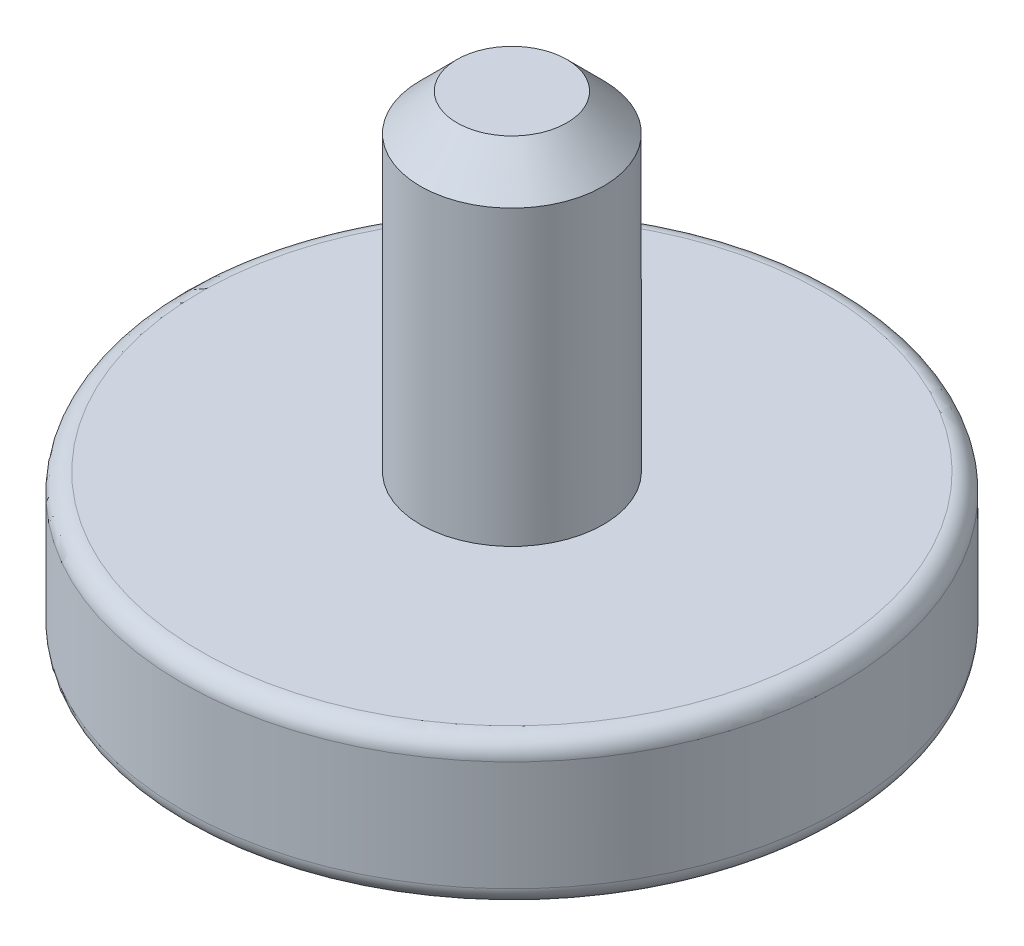
ISO-10303-21;
HEADER;
FILE_DESCRIPTION(('STEP AP214'),'2;1');
FILE_NAME('part.step','',(''),(''),'','','');
FILE_SCHEMA(('AUTOMOTIVE_DESIGN { 1 0 10303 214 1 1 1 1 }'));
ENDSEC;
DATA;
#1=APPLICATION_CONTEXT('core data for automotive mechanical design processes');
#2=APPLICATION_PROTOCOL_DEFINITION('international standard','automotive_design',2000,#1);
#3=PRODUCT_CONTEXT('',#1,'mechanical');
#4=PRODUCT('Part','Part','',(#3));
#5=PRODUCT_RELATED_PRODUCT_CATEGORY('part','',(#4));
#6=PRODUCT_DEFINITION_FORMATION('','',#4);
#7=PRODUCT_DEFINITION_CONTEXT('part definition',#1,'design');
#8=PRODUCT_DEFINITION('design','',#6,#7);
#9=PRODUCT_DEFINITION_SHAPE('','',#8);
#10=(LENGTH_UNIT() NAMED_UNIT(*) SI_UNIT(.MILLI.,.METRE.));
#11=(NAMED_UNIT(*) PLANE_ANGLE_UNIT() SI_UNIT($,.RADIAN.));
#12=(NAMED_UNIT(*) SI_UNIT($,.STERADIAN.) SOLID_ANGLE_UNIT());
#13=UNCERTAINTY_MEASURE_WITH_UNIT(LENGTH_MEASURE(1.E-05),#10,'distance_accuracy_value','');
#14=(GEOMETRIC_REPRESENTATION_CONTEXT(3) GLOBAL_UNCERTAINTY_ASSIGNED_CONTEXT((#13)) GLOBAL_UNIT_ASSIGNED_CONTEXT((#10,
#11,#12)) REPRESENTATION_CONTEXT('',''));
#15=CARTESIAN_POINT('',(0.,0.,0.));
#16=DIRECTION('',(0.,0.,1.));
#17=DIRECTION('',(1.,0.,0.));
#18=AXIS2_PLACEMENT_3D('',#15,#16,#17);
#19=CARTESIAN_POINT('',(0.,0.,0.));
#20=DIRECTION('',(0.,1.,0.));
#21=DIRECTION('',(0.,0.,1.));
#22=AXIS2_PLACEMENT_3D('',#19,#20,#21);
#23=PLANE('',#22);
#24=CARTESIAN_POINT('',(0.,0.,0.));
#25=DIRECTION('',(0.,1.,0.));
#26=DIRECTION('',(0.,0.,1.));
#27=AXIS2_PLACEMENT_3D('',#24,#25,#26);
#28=CIRCLE('',#27,1.);
#29=CARTESIAN_POINT('',(0.,0.,1.));
#30=VERTEX_POINT('',#29);
#31=EDGE_CURVE('E10',#30,#30,#28,.F.);
#32=ORIENTED_EDGE('',*,*,#31,.T.);
#33=EDGE_LOOP('',(#32));
#34=FACE_BOUND('',#33,.T.);
#35=ADVANCED_FACE('F30',(#34),#23,.F.);
#36=CARTESIAN_POINT('',(0.,8.13,0.));
#37=DIRECTION('',(0.,1.,0.));
#38=DIRECTION('',(0.,0.,1.));
#39=AXIS2_PLACEMENT_3D('',#36,#37,#38);
#40=CYLINDRICAL_SURFACE('',#39,1.75);
#41=CARTESIAN_POINT('',(0.,0.792893218813452,0.));
#42=DIRECTION('',(0.,1.,0.));
#43=DIRECTION('',(0.,0.,1.));
#44=AXIS2_PLACEMENT_3D('',#41,#42,#43);
#45=CIRCLE('',#44,1.75);
#46=CARTESIAN_POINT('',(0.,0.792893218813452,1.75));
#47=VERTEX_POINT('',#46);
#48=EDGE_CURVE('E37',#47,#47,#45,.F.);
#49=ORIENTED_EDGE('',*,*,#48,.T.);
#50=EDGE_LOOP('',(#49));
#51=FACE_BOUND('',#50,.T.);
#52=CARTESIAN_POINT('',(0.,0.75,0.));
#53=DIRECTION('',(0.,1.,0.));
#54=DIRECTION('',(0.,0.,1.));
#55=AXIS2_PLACEMENT_3D('',#52,#53,#54);
#56=CIRCLE('',#55,1.75);
#57=CARTESIAN_POINT('',(0.,0.75,1.75));
#58=VERTEX_POINT('',#57);
#59=EDGE_CURVE('E41',#58,#58,#56,.T.);
#60=ORIENTED_EDGE('',*,*,#59,.T.);
#61=EDGE_LOOP('',(#60));
#62=FACE_BOUND('',#61,.T.);
#63=ADVANCED_FACE('F93',(#51,#62),#40,.T.);
#64=CARTESIAN_POINT('',(0.,8.13,0.));
#65=DIRECTION('',(0.,1.,0.));
#66=DIRECTION('',(0.,0.,1.));
#67=AXIS2_PLACEMENT_3D('',#64,#65,#66);
#68=CYLINDRICAL_SURFACE('',#67,1.25);
#69=CARTESIAN_POINT('',(0.,4.5,0.));
#70=DIRECTION('',(0.,1.,0.));
#71=DIRECTION('',(0.,0.,1.));
#72=AXIS2_PLACEMENT_3D('',#69,#70,#71);
#73=CIRCLE('',#72,1.25);
#74=CARTESIAN_POINT('',(0.,4.5,1.25));
#75=VERTEX_POINT('',#74);
#76=EDGE_CURVE('E68',#75,#75,#73,.T.);
#77=ORIENTED_EDGE('',*,*,#76,.F.);
#78=EDGE_LOOP('',(#77));
#79=FACE_BOUND('',#78,.T.);
#80=CARTESIAN_POINT('',(0.,1.5,0.));
#81=DIRECTION('',(0.,1.,0.));
#82=DIRECTION('',(0.,0.,1.));
#83=AXIS2_PLACEMENT_3D('',#80,#81,#82);
#84=CIRCLE('',#83,1.25);
#85=CARTESIAN_POINT('',(0.,1.5,1.25));
#86=VERTEX_POINT('',#85);
#87=EDGE_CURVE('E65',#86,#86,#84,.T.);
#88=ORIENTED_EDGE('',*,*,#87,.T.);
#89=EDGE_LOOP('',(#88));
#90=FACE_BOUND('',#89,.T.);
#91=ADVANCED_FACE('F98',(#79,#90),#68,.T.);
#92=CARTESIAN_POINT('',(1.25,4.5,0.));
#93=DIRECTION('',(0.,1.,0.));
#94=DIRECTION('',(0.,0.,1.));
#95=AXIS2_PLACEMENT_3D('',#92,#93,#94);
#96=PLANE('',#95);
#97=CARTESIAN_POINT('',(0.,4.5,0.));
#98=DIRECTION('',(0.,1.,0.));
#99=DIRECTION('',(0.,0.,1.));
#100=AXIS2_PLACEMENT_3D('',#97,#98,#99);
#101=CIRCLE('',#100,8.5);
#102=CARTESIAN_POINT('',(0.,4.5,8.5));
#103=VERTEX_POINT('',#102);
#104=EDGE_CURVE('E56',#103,#103,#101,.F.);
#105=ORIENTED_EDGE('',*,*,#104,.T.);
#106=EDGE_LOOP('',(#105));
#107=FACE_BOUND('',#106,.T.);
#108=ORIENTED_EDGE('',*,*,#76,.T.);
#109=EDGE_LOOP('',(#108));
#110=FACE_BOUND('',#109,.T.);
#111=ADVANCED_FACE('F89',(#107,#110),#96,.F.);
#112=CARTESIAN_POINT('',(0.,8.13,0.));
#113=DIRECTION('',(0.,1.,0.));
#114=DIRECTION('',(0.,0.,1.));
#115=AXIS2_PLACEMENT_3D('',#112,#113,#114);
#116=CYLINDRICAL_SURFACE('',#115,9.);
#117=CARTESIAN_POINT('',(0.,5.,0.));
#118=DIRECTION('',(0.,1.,0.));
#119=DIRECTION('',(0.,0.,1.));
#120=AXIS2_PLACEMENT_3D('',#117,#118,#119);
#121=CIRCLE('',#120,9.);
#122=CARTESIAN_POINT('',(0.,5.,9.));
#123=VERTEX_POINT('',#122);
#124=EDGE_CURVE('E59',#123,#123,#121,.T.);
#125=ORIENTED_EDGE('',*,*,#124,.T.);
#126=EDGE_LOOP('',(#125));
#127=FACE_BOUND('',#126,.T.);
#128=CARTESIAN_POINT('',(0.,8.,0.));
#129=DIRECTION('',(0.,-1.,0.));
#130=DIRECTION('',(0.,0.,-1.));
#131=AXIS2_PLACEMENT_3D('',#128,#129,#130);
#132=CIRCLE('',#131,9.);
#133=CARTESIAN_POINT('',(0.,8.,-9.));
#134=VERTEX_POINT('',#133);
#135=EDGE_CURVE('E62',#134,#134,#132,.T.);
#136=ORIENTED_EDGE('',*,*,#135,.T.);
#137=EDGE_LOOP('',(#136));
#138=FACE_BOUND('',#137,.T.);
#139=ADVANCED_FACE('F79',(#127,#138),#116,.T.);
#140=CARTESIAN_POINT('',(9.,8.5,0.));
#141=DIRECTION('',(0.,-1.,0.));
#142=DIRECTION('',(0.,0.,-1.));
#143=AXIS2_PLACEMENT_3D('',#140,#141,#142);
#144=PLANE('',#143);
#145=CARTESIAN_POINT('',(0.,8.5,0.));
#146=DIRECTION('',(0.,-1.,0.));
#147=DIRECTION('',(0.,0.,-1.));
#148=AXIS2_PLACEMENT_3D('',#145,#146,#147);
#149=CIRCLE('',#148,8.5);
#150=CARTESIAN_POINT('',(0.,8.5,-8.5));
#151=VERTEX_POINT('',#150);
#152=EDGE_CURVE('E53',#151,#151,#149,.F.);
#153=ORIENTED_EDGE('',*,*,#152,.T.);
#154=EDGE_LOOP('',(#153));
#155=FACE_BOUND('',#154,.T.);
#156=CARTESIAN_POINT('',(0.,8.5,0.));
#157=DIRECTION('',(0.,1.,0.));
#158=DIRECTION('',(0.,0.,1.));
#159=AXIS2_PLACEMENT_3D('',#156,#157,#158);
#160=CIRCLE('',#159,2.5);
#161=CARTESIAN_POINT('',(0.,8.5,2.5));
#162=VERTEX_POINT('',#161);
#163=EDGE_CURVE('E71',#162,#162,#160,.T.);
#164=ORIENTED_EDGE('',*,*,#163,.F.);
#165=EDGE_LOOP('',(#164));
#166=FACE_BOUND('',#165,.T.);
#167=ADVANCED_FACE('F77',(#155,#166),#144,.F.);
#168=CARTESIAN_POINT('',(0.,8.13,0.));
#169=DIRECTION('',(0.,1.,0.));
#170=DIRECTION('',(0.,0.,1.));
#171=AXIS2_PLACEMENT_3D('',#168,#169,#170);
#172=CYLINDRICAL_SURFACE('',#171,2.5);
#173=CARTESIAN_POINT('',(0.,16.5,0.));
#174=DIRECTION('',(0.,-1.,0.));
#175=DIRECTION('',(0.,0.,-1.));
#176=AXIS2_PLACEMENT_3D('',#173,#174,#175);
#177=CIRCLE('',#176,2.5);
#178=CARTESIAN_POINT('',(0.,16.5,-2.5));
#179=VERTEX_POINT('',#178);
#180=EDGE_CURVE('E45',#179,#179,#177,.T.);
#181=ORIENTED_EDGE('',*,*,#180,.T.);
#182=EDGE_LOOP('',(#181));
#183=FACE_BOUND('',#182,.T.);
#184=ORIENTED_EDGE('',*,*,#163,.T.);
#185=EDGE_LOOP('',(#184));
#186=FACE_BOUND('',#185,.T.);
#187=ADVANCED_FACE('F75',(#183,#186),#172,.T.);
#188=CARTESIAN_POINT('',(2.5,17.5,0.));
#189=DIRECTION('',(0.,-1.,0.));
#190=DIRECTION('',(0.,0.,-1.));
#191=AXIS2_PLACEMENT_3D('',#188,#189,#190);
#192=PLANE('',#191);
#193=CARTESIAN_POINT('',(0.,17.5,0.));
#194=DIRECTION('',(0.,-1.,0.));
#195=DIRECTION('',(0.,0.,-1.));
#196=AXIS2_PLACEMENT_3D('',#193,#194,#195);
#197=CIRCLE('',#196,1.5);
#198=CARTESIAN_POINT('',(0.,17.5,-1.5));
#199=VERTEX_POINT('',#198);
#200=EDGE_CURVE('E50',#199,#199,#197,.F.);
#201=ORIENTED_EDGE('',*,*,#200,.T.);
#202=EDGE_LOOP('',(#201));
#203=FACE_BOUND('',#202,.T.);
#204=ADVANCED_FACE('F86',(#203),#192,.F.);
#205=CARTESIAN_POINT('',(0.,5.,0.));
#206=DIRECTION('',(0.,1.,0.));
#207=DIRECTION('',(0.,0.,1.));
#208=AXIS2_PLACEMENT_3D('',#205,#206,#207);
#209=TOROIDAL_SURFACE('',#208,8.5,0.5);
#210=ORIENTED_EDGE('',*,*,#104,.F.);
#211=EDGE_LOOP('',(#210));
#212=FACE_BOUND('',#211,.T.);
#213=ORIENTED_EDGE('',*,*,#124,.F.);
#214=EDGE_LOOP('',(#213));
#215=FACE_BOUND('',#214,.T.);
#216=ADVANCED_FACE('F102',(#212,#215),#209,.T.);
#217=CARTESIAN_POINT('',(0.,8.,0.));
#218=DIRECTION('',(0.,-1.,0.));
#219=DIRECTION('',(0.,0.,-1.));
#220=AXIS2_PLACEMENT_3D('',#217,#218,#219);
#221=TOROIDAL_SURFACE('',#220,8.5,0.5);
#222=ORIENTED_EDGE('',*,*,#135,.F.);
#223=EDGE_LOOP('',(#222));
#224=FACE_BOUND('',#223,.T.);
#225=ORIENTED_EDGE('',*,*,#152,.F.);
#226=EDGE_LOOP('',(#225));
#227=FACE_BOUND('',#226,.T.);
#228=ADVANCED_FACE('F105',(#224,#227),#221,.T.);
#229=CARTESIAN_POINT('',(0.,17.5,0.));
#230=DIRECTION('',(0.,-1.,0.));
#231=DIRECTION('',(0.,0.,-1.));
#232=AXIS2_PLACEMENT_3D('',#229,#230,#231);
#233=CONICAL_SURFACE('',#232,1.5,0.785398163397447);
#234=ORIENTED_EDGE('',*,*,#180,.F.);
#235=EDGE_LOOP('',(#234));
#236=FACE_BOUND('',#235,.T.);
#237=ORIENTED_EDGE('',*,*,#200,.F.);
#238=EDGE_LOOP('',(#237));
#239=FACE_BOUND('',#238,.T.);
#240=ADVANCED_FACE('F109',(#236,#239),#233,.T.);
#241=CARTESIAN_POINT('',(0.,0.792893218813452,0.));
#242=DIRECTION('',(0.,1.,0.));
#243=DIRECTION('',(0.,0.,1.));
#244=AXIS2_PLACEMENT_3D('',#241,#242,#243);
#245=TOROIDAL_SURFACE('',#244,1.,0.75);
#246=ORIENTED_EDGE('',*,*,#48,.F.);
#247=EDGE_LOOP('',(#246));
#248=FACE_BOUND('',#247,.T.);
#249=ORIENTED_EDGE('',*,*,#87,.F.);
#250=EDGE_LOOP('',(#249));
#251=FACE_BOUND('',#250,.T.);
#252=ADVANCED_FACE('F112',(#248,#251),#245,.T.);
#253=CARTESIAN_POINT('',(0.,0.75,0.));
#254=DIRECTION('',(0.,1.,0.));
#255=DIRECTION('',(0.,0.,1.));
#256=AXIS2_PLACEMENT_3D('',#253,#254,#255);
#257=TOROIDAL_SURFACE('',#256,1.,0.75);
#258=ORIENTED_EDGE('',*,*,#31,.F.);
#259=EDGE_LOOP('',(#258));
#260=FACE_BOUND('',#259,.T.);
#261=ORIENTED_EDGE('',*,*,#59,.F.);
#262=EDGE_LOOP('',(#261));
#263=FACE_BOUND('',#262,.T.);
#264=ADVANCED_FACE('F32',(#260,#263),#257,.T.);
#265=CLOSED_SHELL('',(#35,#63,#91,#111,#139,#167,#187,#204,#216,#228,#240,#252,#264));
#266=MANIFOLD_SOLID_BREP('B2',#265);
#267=ADVANCED_BREP_SHAPE_REPRESENTATION('',(#18,#266),#14);
#268=SHAPE_DEFINITION_REPRESENTATION(#9,#267);
ENDSEC;
END-ISO-10303-21;
